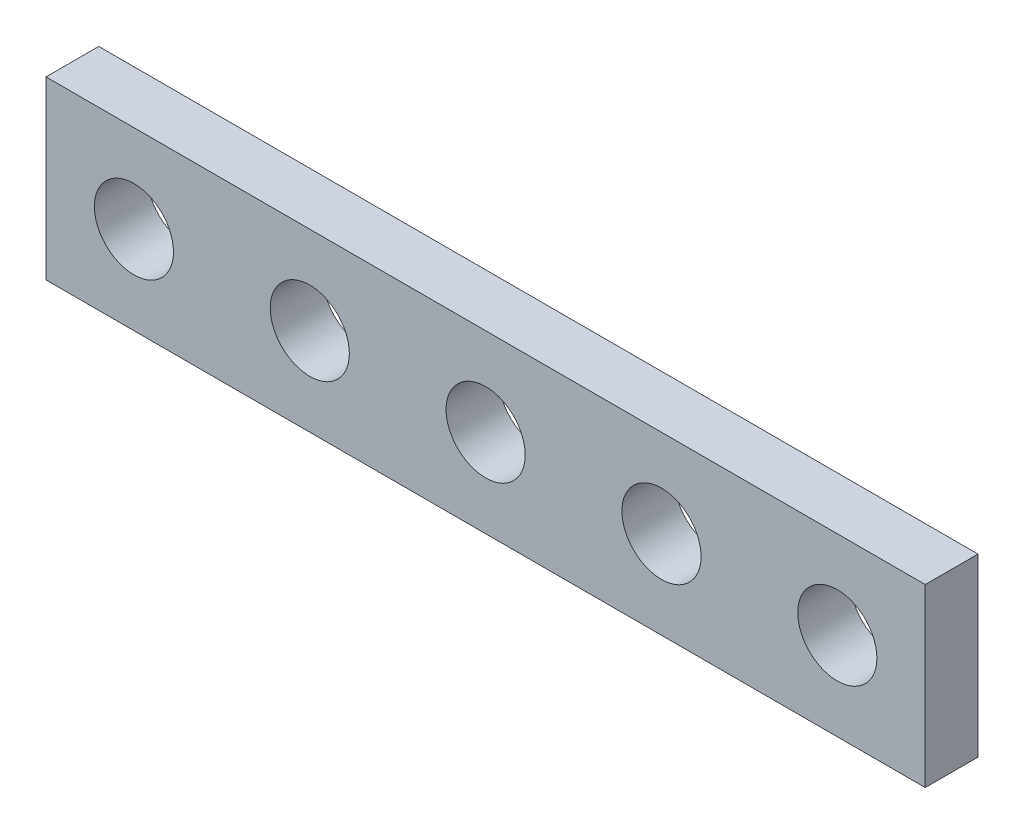
ISO-10303-21;
HEADER;
FILE_DESCRIPTION(('STEP AP214'),'2;1');
FILE_NAME('part.step','',(''),(''),'','','');
FILE_SCHEMA(('AUTOMOTIVE_DESIGN { 1 0 10303 214 1 1 1 1 }'));
ENDSEC;
DATA;
#1=APPLICATION_CONTEXT('core data for automotive mechanical design processes');
#2=APPLICATION_PROTOCOL_DEFINITION('international standard','automotive_design',2000,#1);
#3=PRODUCT_CONTEXT('',#1,'mechanical');
#4=PRODUCT('Part','Part','',(#3));
#5=PRODUCT_RELATED_PRODUCT_CATEGORY('part','',(#4));
#6=PRODUCT_DEFINITION_FORMATION('','',#4);
#7=PRODUCT_DEFINITION_CONTEXT('part definition',#1,'design');
#8=PRODUCT_DEFINITION('design','',#6,#7);
#9=PRODUCT_DEFINITION_SHAPE('','',#8);
#10=(LENGTH_UNIT() NAMED_UNIT(*) SI_UNIT(.MILLI.,.METRE.));
#11=(NAMED_UNIT(*) PLANE_ANGLE_UNIT() SI_UNIT($,.RADIAN.));
#12=(NAMED_UNIT(*) SI_UNIT($,.STERADIAN.) SOLID_ANGLE_UNIT());
#13=UNCERTAINTY_MEASURE_WITH_UNIT(LENGTH_MEASURE(1.E-05),#10,'distance_accuracy_value','');
#14=(GEOMETRIC_REPRESENTATION_CONTEXT(3) GLOBAL_UNCERTAINTY_ASSIGNED_CONTEXT((#13)) GLOBAL_UNIT_ASSIGNED_CONTEXT((#10,
#11,#12)) REPRESENTATION_CONTEXT('',''));
#15=CARTESIAN_POINT('',(0.,0.,0.));
#16=DIRECTION('',(0.,0.,1.));
#17=DIRECTION('',(1.,0.,0.));
#18=AXIS2_PLACEMENT_3D('',#15,#16,#17);
#19=CARTESIAN_POINT('',(50.,0.,3.));
#20=DIRECTION('',(0.,1.,0.));
#21=DIRECTION('',(-1.,0.,0.));
#22=AXIS2_PLACEMENT_3D('',#19,#20,#21);
#23=PLANE('',#22);
#24=DIRECTION('',(1.,0.,0.));
#25=VECTOR('',#24,1.);
#26=CARTESIAN_POINT('',(50.,0.,0.));
#27=LINE('',#26,#25);
#28=CARTESIAN_POINT('',(0.,0.,0.));
#29=VERTEX_POINT('',#28);
#30=CARTESIAN_POINT('',(50.,0.,0.));
#31=VERTEX_POINT('',#30);
#32=EDGE_CURVE('E111',#29,#31,#27,.T.);
#33=ORIENTED_EDGE('',*,*,#32,.T.);
#34=DIRECTION('',(0.,0.,-1.));
#35=VECTOR('',#34,1.);
#36=CARTESIAN_POINT('',(50.,0.,3.));
#37=LINE('',#36,#35);
#38=CARTESIAN_POINT('',(50.,0.,3.));
#39=VERTEX_POINT('',#38);
#40=EDGE_CURVE('E11',#39,#31,#37,.T.);
#41=ORIENTED_EDGE('',*,*,#40,.F.);
#42=DIRECTION('',(1.,0.,0.));
#43=VECTOR('',#42,1.);
#44=CARTESIAN_POINT('',(50.,0.,3.));
#45=LINE('',#44,#43);
#46=CARTESIAN_POINT('',(0.,0.,3.));
#47=VERTEX_POINT('',#46);
#48=EDGE_CURVE('E95',#47,#39,#45,.T.);
#49=ORIENTED_EDGE('',*,*,#48,.F.);
#50=DIRECTION('',(0.,0.,-1.));
#51=VECTOR('',#50,1.);
#52=CARTESIAN_POINT('',(0.,0.,3.));
#53=LINE('',#52,#51);
#54=EDGE_CURVE('E107',#47,#29,#53,.T.);
#55=ORIENTED_EDGE('',*,*,#54,.T.);
#56=EDGE_LOOP('',(#33,#41,#49,#55));
#57=FACE_BOUND('',#56,.T.);
#58=ADVANCED_FACE('F43',(#57),#23,.F.);
#59=CARTESIAN_POINT('',(50.,10.,3.));
#60=DIRECTION('',(-1.,0.,0.));
#61=DIRECTION('',(0.,0.,1.));
#62=AXIS2_PLACEMENT_3D('',#59,#60,#61);
#63=PLANE('',#62);
#64=DIRECTION('',(0.,1.,0.));
#65=VECTOR('',#64,1.);
#66=CARTESIAN_POINT('',(50.,10.,0.));
#67=LINE('',#66,#65);
#68=CARTESIAN_POINT('',(50.,10.,0.));
#69=VERTEX_POINT('',#68);
#70=EDGE_CURVE('E100',#31,#69,#67,.T.);
#71=ORIENTED_EDGE('',*,*,#70,.T.);
#72=DIRECTION('',(0.,0.,-1.));
#73=VECTOR('',#72,1.);
#74=CARTESIAN_POINT('',(50.,10.,3.));
#75=LINE('',#74,#73);
#76=CARTESIAN_POINT('',(50.,10.,3.));
#77=VERTEX_POINT('',#76);
#78=EDGE_CURVE('E52',#77,#69,#75,.T.);
#79=ORIENTED_EDGE('',*,*,#78,.F.);
#80=DIRECTION('',(0.,1.,0.));
#81=VECTOR('',#80,1.);
#82=CARTESIAN_POINT('',(50.,10.,3.));
#83=LINE('',#82,#81);
#84=EDGE_CURVE('E90',#39,#77,#83,.T.);
#85=ORIENTED_EDGE('',*,*,#84,.F.);
#86=ORIENTED_EDGE('',*,*,#40,.T.);
#87=EDGE_LOOP('',(#71,#79,#85,#86));
#88=FACE_BOUND('',#87,.T.);
#89=ADVANCED_FACE('F99',(#88),#63,.F.);
#90=CARTESIAN_POINT('',(0.,10.,3.));
#91=DIRECTION('',(0.,-1.,0.));
#92=DIRECTION('',(0.,0.,-1.));
#93=AXIS2_PLACEMENT_3D('',#90,#91,#92);
#94=PLANE('',#93);
#95=DIRECTION('',(-1.,0.,0.));
#96=VECTOR('',#95,1.);
#97=CARTESIAN_POINT('',(0.,10.,0.));
#98=LINE('',#97,#96);
#99=CARTESIAN_POINT('',(0.,10.,0.));
#100=VERTEX_POINT('',#99);
#101=EDGE_CURVE('E77',#69,#100,#98,.T.);
#102=ORIENTED_EDGE('',*,*,#101,.T.);
#103=DIRECTION('',(0.,0.,-1.));
#104=VECTOR('',#103,1.);
#105=CARTESIAN_POINT('',(0.,10.,3.));
#106=LINE('',#105,#104);
#107=CARTESIAN_POINT('',(0.,10.,3.));
#108=VERTEX_POINT('',#107);
#109=EDGE_CURVE('E102',#108,#100,#106,.T.);
#110=ORIENTED_EDGE('',*,*,#109,.F.);
#111=DIRECTION('',(-1.,0.,0.));
#112=VECTOR('',#111,1.);
#113=CARTESIAN_POINT('',(0.,10.,3.));
#114=LINE('',#113,#112);
#115=EDGE_CURVE('E93',#77,#108,#114,.T.);
#116=ORIENTED_EDGE('',*,*,#115,.F.);
#117=ORIENTED_EDGE('',*,*,#78,.T.);
#118=EDGE_LOOP('',(#102,#110,#116,#117));
#119=FACE_BOUND('',#118,.T.);
#120=ADVANCED_FACE('F103',(#119),#94,.F.);
#121=CARTESIAN_POINT('',(0.,0.,3.));
#122=DIRECTION('',(1.,0.,0.));
#123=DIRECTION('',(0.,0.,-1.));
#124=AXIS2_PLACEMENT_3D('',#121,#122,#123);
#125=PLANE('',#124);
#126=DIRECTION('',(0.,-1.,0.));
#127=VECTOR('',#126,1.);
#128=CARTESIAN_POINT('',(0.,0.,0.));
#129=LINE('',#128,#127);
#130=EDGE_CURVE('E83',#100,#29,#129,.T.);
#131=ORIENTED_EDGE('',*,*,#130,.T.);
#132=ORIENTED_EDGE('',*,*,#54,.F.);
#133=DIRECTION('',(0.,-1.,0.));
#134=VECTOR('',#133,1.);
#135=CARTESIAN_POINT('',(0.,0.,3.));
#136=LINE('',#135,#134);
#137=EDGE_CURVE('E60',#108,#47,#136,.T.);
#138=ORIENTED_EDGE('',*,*,#137,.F.);
#139=ORIENTED_EDGE('',*,*,#109,.T.);
#140=EDGE_LOOP('',(#131,#132,#138,#139));
#141=FACE_BOUND('',#140,.T.);
#142=ADVANCED_FACE('F125',(#141),#125,.F.);
#143=CARTESIAN_POINT('',(0.,0.,3.));
#144=DIRECTION('',(0.,0.,-1.));
#145=DIRECTION('',(-1.,0.,0.));
#146=AXIS2_PLACEMENT_3D('',#143,#144,#145);
#147=PLANE('',#146);
#148=CARTESIAN_POINT('',(5.,5.,3.));
#149=DIRECTION('',(0.,0.,1.));
#150=DIRECTION('',(1.,0.,0.));
#151=AXIS2_PLACEMENT_3D('',#148,#149,#150);
#152=CIRCLE('',#151,2.25);
#153=CARTESIAN_POINT('',(7.25,5.,3.));
#154=VERTEX_POINT('',#153);
#155=EDGE_CURVE('E164',#154,#154,#152,.T.);
#156=ORIENTED_EDGE('',*,*,#155,.F.);
#157=EDGE_LOOP('',(#156));
#158=FACE_BOUND('',#157,.T.);
#159=CARTESIAN_POINT('',(15.,5.,3.));
#160=DIRECTION('',(0.,0.,1.));
#161=DIRECTION('',(1.,0.,0.));
#162=AXIS2_PLACEMENT_3D('',#159,#160,#161);
#163=CIRCLE('',#162,2.25);
#164=CARTESIAN_POINT('',(17.25,5.,3.));
#165=VERTEX_POINT('',#164);
#166=EDGE_CURVE('E160',#165,#165,#163,.T.);
#167=ORIENTED_EDGE('',*,*,#166,.F.);
#168=EDGE_LOOP('',(#167));
#169=FACE_BOUND('',#168,.T.);
#170=CARTESIAN_POINT('',(25.,5.,3.));
#171=DIRECTION('',(0.,0.,1.));
#172=DIRECTION('',(1.,0.,0.));
#173=AXIS2_PLACEMENT_3D('',#170,#171,#172);
#174=CIRCLE('',#173,2.25);
#175=CARTESIAN_POINT('',(27.25,5.,3.));
#176=VERTEX_POINT('',#175);
#177=EDGE_CURVE('E152',#176,#176,#174,.T.);
#178=ORIENTED_EDGE('',*,*,#177,.F.);
#179=EDGE_LOOP('',(#178));
#180=FACE_BOUND('',#179,.T.);
#181=CARTESIAN_POINT('',(35.,5.,3.));
#182=DIRECTION('',(0.,0.,1.));
#183=DIRECTION('',(1.,0.,0.));
#184=AXIS2_PLACEMENT_3D('',#181,#182,#183);
#185=CIRCLE('',#184,2.25);
#186=CARTESIAN_POINT('',(37.25,5.,3.));
#187=VERTEX_POINT('',#186);
#188=EDGE_CURVE('E144',#187,#187,#185,.T.);
#189=ORIENTED_EDGE('',*,*,#188,.F.);
#190=EDGE_LOOP('',(#189));
#191=FACE_BOUND('',#190,.T.);
#192=CARTESIAN_POINT('',(45.,5.,3.));
#193=DIRECTION('',(0.,0.,1.));
#194=DIRECTION('',(1.,0.,0.));
#195=AXIS2_PLACEMENT_3D('',#192,#193,#194);
#196=CIRCLE('',#195,2.25);
#197=CARTESIAN_POINT('',(47.25,5.,3.));
#198=VERTEX_POINT('',#197);
#199=EDGE_CURVE('E136',#198,#198,#196,.T.);
#200=ORIENTED_EDGE('',*,*,#199,.F.);
#201=EDGE_LOOP('',(#200));
#202=FACE_BOUND('',#201,.T.);
#203=ORIENTED_EDGE('',*,*,#48,.T.);
#204=ORIENTED_EDGE('',*,*,#84,.T.);
#205=ORIENTED_EDGE('',*,*,#115,.T.);
#206=ORIENTED_EDGE('',*,*,#137,.T.);
#207=EDGE_LOOP('',(#203,#204,#205,#206));
#208=FACE_BOUND('',#207,.T.);
#209=ADVANCED_FACE('F91',(#158,#169,#180,#191,#202,#208),#147,.F.);
#210=CARTESIAN_POINT('',(0.,0.,0.));
#211=DIRECTION('',(0.,0.,-1.));
#212=DIRECTION('',(-1.,0.,0.));
#213=AXIS2_PLACEMENT_3D('',#210,#211,#212);
#214=PLANE('',#213);
#215=CARTESIAN_POINT('',(5.,5.,0.));
#216=DIRECTION('',(0.,0.,1.));
#217=DIRECTION('',(1.,0.,0.));
#218=AXIS2_PLACEMENT_3D('',#215,#216,#217);
#219=CIRCLE('',#218,2.25);
#220=CARTESIAN_POINT('',(7.25,5.,0.));
#221=VERTEX_POINT('',#220);
#222=EDGE_CURVE('E115',#221,#221,#219,.T.);
#223=ORIENTED_EDGE('',*,*,#222,.T.);
#224=EDGE_LOOP('',(#223));
#225=FACE_BOUND('',#224,.T.);
#226=CARTESIAN_POINT('',(15.,5.,0.));
#227=DIRECTION('',(0.,0.,1.));
#228=DIRECTION('',(1.,0.,0.));
#229=AXIS2_PLACEMENT_3D('',#226,#227,#228);
#230=CIRCLE('',#229,2.25);
#231=CARTESIAN_POINT('',(17.25,5.,0.));
#232=VERTEX_POINT('',#231);
#233=EDGE_CURVE('E156',#232,#232,#230,.T.);
#234=ORIENTED_EDGE('',*,*,#233,.T.);
#235=EDGE_LOOP('',(#234));
#236=FACE_BOUND('',#235,.T.);
#237=CARTESIAN_POINT('',(25.,5.,0.));
#238=DIRECTION('',(0.,0.,1.));
#239=DIRECTION('',(1.,0.,0.));
#240=AXIS2_PLACEMENT_3D('',#237,#238,#239);
#241=CIRCLE('',#240,2.25);
#242=CARTESIAN_POINT('',(27.25,5.,0.));
#243=VERTEX_POINT('',#242);
#244=EDGE_CURVE('E148',#243,#243,#241,.T.);
#245=ORIENTED_EDGE('',*,*,#244,.T.);
#246=EDGE_LOOP('',(#245));
#247=FACE_BOUND('',#246,.T.);
#248=CARTESIAN_POINT('',(35.,5.,0.));
#249=DIRECTION('',(0.,0.,1.));
#250=DIRECTION('',(1.,0.,0.));
#251=AXIS2_PLACEMENT_3D('',#248,#249,#250);
#252=CIRCLE('',#251,2.25);
#253=CARTESIAN_POINT('',(37.25,5.,0.));
#254=VERTEX_POINT('',#253);
#255=EDGE_CURVE('E140',#254,#254,#252,.T.);
#256=ORIENTED_EDGE('',*,*,#255,.T.);
#257=EDGE_LOOP('',(#256));
#258=FACE_BOUND('',#257,.T.);
#259=CARTESIAN_POINT('',(45.,5.,0.));
#260=DIRECTION('',(0.,0.,1.));
#261=DIRECTION('',(1.,0.,0.));
#262=AXIS2_PLACEMENT_3D('',#259,#260,#261);
#263=CIRCLE('',#262,2.25);
#264=CARTESIAN_POINT('',(47.25,5.,0.));
#265=VERTEX_POINT('',#264);
#266=EDGE_CURVE('E132',#265,#265,#263,.T.);
#267=ORIENTED_EDGE('',*,*,#266,.T.);
#268=EDGE_LOOP('',(#267));
#269=FACE_BOUND('',#268,.T.);
#270=ORIENTED_EDGE('',*,*,#32,.F.);
#271=ORIENTED_EDGE('',*,*,#130,.F.);
#272=ORIENTED_EDGE('',*,*,#101,.F.);
#273=ORIENTED_EDGE('',*,*,#70,.F.);
#274=EDGE_LOOP('',(#270,#271,#272,#273));
#275=FACE_BOUND('',#274,.T.);
#276=ADVANCED_FACE('F128',(#225,#236,#247,#258,#269,#275),#214,.T.);
#277=CARTESIAN_POINT('',(45.,5.,0.));
#278=DIRECTION('',(0.,0.,1.));
#279=DIRECTION('',(1.,0.,0.));
#280=AXIS2_PLACEMENT_3D('',#277,#278,#279);
#281=CYLINDRICAL_SURFACE('',#280,2.25);
#282=ORIENTED_EDGE('',*,*,#266,.F.);
#283=EDGE_LOOP('',(#282));
#284=FACE_BOUND('',#283,.T.);
#285=ORIENTED_EDGE('',*,*,#199,.T.);
#286=EDGE_LOOP('',(#285));
#287=FACE_BOUND('',#286,.T.);
#288=ADVANCED_FACE('F192',(#284,#287),#281,.F.);
#289=CARTESIAN_POINT('',(35.,5.,0.));
#290=DIRECTION('',(0.,0.,1.));
#291=DIRECTION('',(1.,0.,0.));
#292=AXIS2_PLACEMENT_3D('',#289,#290,#291);
#293=CYLINDRICAL_SURFACE('',#292,2.25);
#294=ORIENTED_EDGE('',*,*,#255,.F.);
#295=EDGE_LOOP('',(#294));
#296=FACE_BOUND('',#295,.T.);
#297=ORIENTED_EDGE('',*,*,#188,.T.);
#298=EDGE_LOOP('',(#297));
#299=FACE_BOUND('',#298,.T.);
#300=ADVANCED_FACE('F194',(#296,#299),#293,.F.);
#301=CARTESIAN_POINT('',(25.,5.,0.));
#302=DIRECTION('',(0.,0.,1.));
#303=DIRECTION('',(1.,0.,0.));
#304=AXIS2_PLACEMENT_3D('',#301,#302,#303);
#305=CYLINDRICAL_SURFACE('',#304,2.25);
#306=ORIENTED_EDGE('',*,*,#244,.F.);
#307=EDGE_LOOP('',(#306));
#308=FACE_BOUND('',#307,.T.);
#309=ORIENTED_EDGE('',*,*,#177,.T.);
#310=EDGE_LOOP('',(#309));
#311=FACE_BOUND('',#310,.T.);
#312=ADVANCED_FACE('F201',(#308,#311),#305,.F.);
#313=CARTESIAN_POINT('',(15.,5.,0.));
#314=DIRECTION('',(0.,0.,1.));
#315=DIRECTION('',(1.,0.,0.));
#316=AXIS2_PLACEMENT_3D('',#313,#314,#315);
#317=CYLINDRICAL_SURFACE('',#316,2.25);
#318=ORIENTED_EDGE('',*,*,#233,.F.);
#319=EDGE_LOOP('',(#318));
#320=FACE_BOUND('',#319,.T.);
#321=ORIENTED_EDGE('',*,*,#166,.T.);
#322=EDGE_LOOP('',(#321));
#323=FACE_BOUND('',#322,.T.);
#324=ADVANCED_FACE('F177',(#320,#323),#317,.F.);
#325=CARTESIAN_POINT('',(5.,5.,0.));
#326=DIRECTION('',(0.,0.,1.));
#327=DIRECTION('',(1.,0.,0.));
#328=AXIS2_PLACEMENT_3D('',#325,#326,#327);
#329=CYLINDRICAL_SURFACE('',#328,2.25);
#330=ORIENTED_EDGE('',*,*,#222,.F.);
#331=EDGE_LOOP('',(#330));
#332=FACE_BOUND('',#331,.T.);
#333=ORIENTED_EDGE('',*,*,#155,.T.);
#334=EDGE_LOOP('',(#333));
#335=FACE_BOUND('',#334,.T.);
#336=ADVANCED_FACE('F174',(#332,#335),#329,.F.);
#337=CLOSED_SHELL('',(#58,#89,#120,#142,#209,#276,#288,#300,#312,#324,#336));
#338=MANIFOLD_SOLID_BREP('B2',#337);
#339=ADVANCED_BREP_SHAPE_REPRESENTATION('',(#18,#338),#14);
#340=SHAPE_DEFINITION_REPRESENTATION(#9,#339);
ENDSEC;
END-ISO-10303-21;
